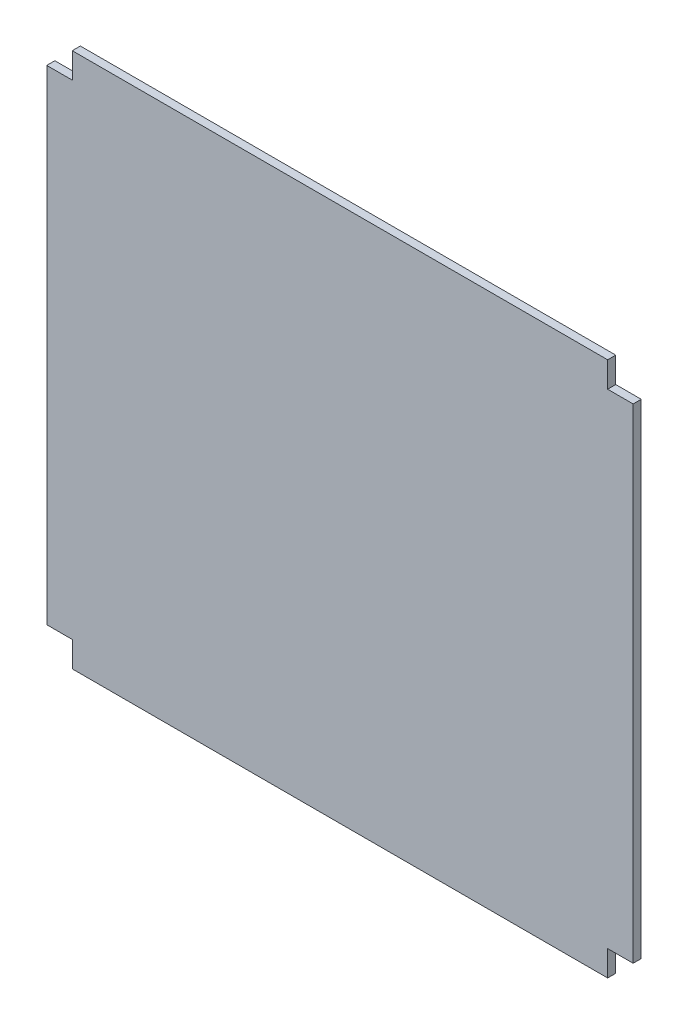
ISO-10303-21;
HEADER;
FILE_DESCRIPTION(('STEP AP214'),'2;1');
FILE_NAME('part.step','',(''),(''),'','','');
FILE_SCHEMA(('AUTOMOTIVE_DESIGN { 1 0 10303 214 1 1 1 1 }'));
ENDSEC;
DATA;
#1=APPLICATION_CONTEXT('core data for automotive mechanical design processes');
#2=APPLICATION_PROTOCOL_DEFINITION('international standard','automotive_design',2000,#1);
#3=PRODUCT_CONTEXT('',#1,'mechanical');
#4=PRODUCT('Part','Part','',(#3));
#5=PRODUCT_RELATED_PRODUCT_CATEGORY('part','',(#4));
#6=PRODUCT_DEFINITION_FORMATION('','',#4);
#7=PRODUCT_DEFINITION_CONTEXT('part definition',#1,'design');
#8=PRODUCT_DEFINITION('design','',#6,#7);
#9=PRODUCT_DEFINITION_SHAPE('','',#8);
#10=(LENGTH_UNIT() NAMED_UNIT(*) SI_UNIT(.MILLI.,.METRE.));
#11=(NAMED_UNIT(*) PLANE_ANGLE_UNIT() SI_UNIT($,.RADIAN.));
#12=(NAMED_UNIT(*) SI_UNIT($,.STERADIAN.) SOLID_ANGLE_UNIT());
#13=UNCERTAINTY_MEASURE_WITH_UNIT(LENGTH_MEASURE(1.E-05),#10,'distance_accuracy_value','');
#14=(GEOMETRIC_REPRESENTATION_CONTEXT(3) GLOBAL_UNCERTAINTY_ASSIGNED_CONTEXT((#13)) GLOBAL_UNIT_ASSIGNED_CONTEXT((#10,
#11,#12)) REPRESENTATION_CONTEXT('',''));
#15=CARTESIAN_POINT('',(0.,0.,0.));
#16=DIRECTION('',(0.,0.,1.));
#17=DIRECTION('',(1.,0.,0.));
#18=AXIS2_PLACEMENT_3D('',#15,#16,#17);
#19=CARTESIAN_POINT('',(-460.,-420.,12.7));
#20=DIRECTION('',(1.,0.,0.));
#21=DIRECTION('',(0.,0.,-1.));
#22=AXIS2_PLACEMENT_3D('',#19,#20,#21);
#23=PLANE('',#22);
#24=DIRECTION('',(0.,-1.,0.));
#25=VECTOR('',#24,1.);
#26=CARTESIAN_POINT('',(-460.,-420.,0.));
#27=LINE('',#26,#25);
#28=CARTESIAN_POINT('',(-460.,380.,0.));
#29=VERTEX_POINT('',#28);
#30=CARTESIAN_POINT('',(-460.,-380.,0.));
#31=VERTEX_POINT('',#30);
#32=EDGE_CURVE('E154',#29,#31,#27,.T.);
#33=ORIENTED_EDGE('',*,*,#32,.T.);
#34=DIRECTION('',(0.,0.,1.));
#35=VECTOR('',#34,1.);
#36=CARTESIAN_POINT('',(-460.,-380.,-56.5685424949242));
#37=LINE('',#36,#35);
#38=CARTESIAN_POINT('',(-460.,-380.,12.7));
#39=VERTEX_POINT('',#38);
#40=EDGE_CURVE('E189',#31,#39,#37,.T.);
#41=ORIENTED_EDGE('',*,*,#40,.T.);
#42=DIRECTION('',(0.,-1.,0.));
#43=VECTOR('',#42,1.);
#44=CARTESIAN_POINT('',(-460.,-420.,12.7));
#45=LINE('',#44,#43);
#46=CARTESIAN_POINT('',(-460.,380.,12.7));
#47=VERTEX_POINT('',#46);
#48=EDGE_CURVE('E150',#47,#39,#45,.T.);
#49=ORIENTED_EDGE('',*,*,#48,.F.);
#50=DIRECTION('',(0.,0.,1.));
#51=VECTOR('',#50,1.);
#52=CARTESIAN_POINT('',(-460.,380.,-56.5685424949242));
#53=LINE('',#52,#51);
#54=EDGE_CURVE('E172',#29,#47,#53,.T.);
#55=ORIENTED_EDGE('',*,*,#54,.F.);
#56=EDGE_LOOP('',(#33,#41,#49,#55));
#57=FACE_BOUND('',#56,.T.);
#58=ADVANCED_FACE('F33',(#57),#23,.F.);
#59=CARTESIAN_POINT('',(460.,-420.,12.7));
#60=DIRECTION('',(0.,1.,0.));
#61=DIRECTION('',(-1.,0.,0.));
#62=AXIS2_PLACEMENT_3D('',#59,#60,#61);
#63=PLANE('',#62);
#64=DIRECTION('',(1.,0.,0.));
#65=VECTOR('',#64,1.);
#66=CARTESIAN_POINT('',(460.,-420.,12.7));
#67=LINE('',#66,#65);
#68=CARTESIAN_POINT('',(-420.,-420.,12.7));
#69=VERTEX_POINT('',#68);
#70=CARTESIAN_POINT('',(420.,-420.,12.7));
#71=VERTEX_POINT('',#70);
#72=EDGE_CURVE('E148',#69,#71,#67,.T.);
#73=ORIENTED_EDGE('',*,*,#72,.F.);
#74=DIRECTION('',(0.,0.,1.));
#75=VECTOR('',#74,1.);
#76=CARTESIAN_POINT('',(-420.,-420.,-56.5685424949242));
#77=LINE('',#76,#75);
#78=CARTESIAN_POINT('',(-420.,-420.,0.));
#79=VERTEX_POINT('',#78);
#80=EDGE_CURVE('E185',#79,#69,#77,.T.);
#81=ORIENTED_EDGE('',*,*,#80,.F.);
#82=DIRECTION('',(1.,0.,0.));
#83=VECTOR('',#82,1.);
#84=CARTESIAN_POINT('',(460.,-420.,0.));
#85=LINE('',#84,#83);
#86=CARTESIAN_POINT('',(420.,-420.,0.));
#87=VERTEX_POINT('',#86);
#88=EDGE_CURVE('E157',#79,#87,#85,.T.);
#89=ORIENTED_EDGE('',*,*,#88,.T.);
#90=DIRECTION('',(0.,0.,1.));
#91=VECTOR('',#90,1.);
#92=CARTESIAN_POINT('',(420.,-420.,-56.5685424949242));
#93=LINE('',#92,#91);
#94=EDGE_CURVE('E213',#87,#71,#93,.T.);
#95=ORIENTED_EDGE('',*,*,#94,.T.);
#96=EDGE_LOOP('',(#73,#81,#89,#95));
#97=FACE_BOUND('',#96,.T.);
#98=ADVANCED_FACE('F250',(#97),#63,.F.);
#99=CARTESIAN_POINT('',(460.,-420.,12.7));
#100=DIRECTION('',(-1.,0.,0.));
#101=DIRECTION('',(0.,0.,1.));
#102=AXIS2_PLACEMENT_3D('',#99,#100,#101);
#103=PLANE('',#102);
#104=DIRECTION('',(0.,1.,0.));
#105=VECTOR('',#104,1.);
#106=CARTESIAN_POINT('',(460.,-420.,0.));
#107=LINE('',#106,#105);
#108=CARTESIAN_POINT('',(460.,-380.,0.));
#109=VERTEX_POINT('',#108);
#110=CARTESIAN_POINT('',(460.,380.,0.));
#111=VERTEX_POINT('',#110);
#112=EDGE_CURVE('E160',#109,#111,#107,.T.);
#113=ORIENTED_EDGE('',*,*,#112,.T.);
#114=DIRECTION('',(0.,0.,1.));
#115=VECTOR('',#114,1.);
#116=CARTESIAN_POINT('',(460.,380.,-56.5685424949242));
#117=LINE('',#116,#115);
#118=CARTESIAN_POINT('',(460.,380.,12.7));
#119=VERTEX_POINT('',#118);
#120=EDGE_CURVE('E147',#111,#119,#117,.T.);
#121=ORIENTED_EDGE('',*,*,#120,.T.);
#122=DIRECTION('',(0.,1.,0.));
#123=VECTOR('',#122,1.);
#124=CARTESIAN_POINT('',(460.,-420.,12.7));
#125=LINE('',#124,#123);
#126=CARTESIAN_POINT('',(460.,-380.,12.7));
#127=VERTEX_POINT('',#126);
#128=EDGE_CURVE('E41',#127,#119,#125,.T.);
#129=ORIENTED_EDGE('',*,*,#128,.F.);
#130=DIRECTION('',(0.,0.,1.));
#131=VECTOR('',#130,1.);
#132=CARTESIAN_POINT('',(460.,-380.,-56.5685424949242));
#133=LINE('',#132,#131);
#134=EDGE_CURVE('E123',#109,#127,#133,.T.);
#135=ORIENTED_EDGE('',*,*,#134,.F.);
#136=EDGE_LOOP('',(#113,#121,#129,#135));
#137=FACE_BOUND('',#136,.T.);
#138=ADVANCED_FACE('F146',(#137),#103,.F.);
#139=CARTESIAN_POINT('',(460.,420.,12.7));
#140=DIRECTION('',(0.,-1.,0.));
#141=DIRECTION('',(1.,0.,0.));
#142=AXIS2_PLACEMENT_3D('',#139,#140,#141);
#143=PLANE('',#142);
#144=DIRECTION('',(-1.,0.,0.));
#145=VECTOR('',#144,1.);
#146=CARTESIAN_POINT('',(460.,420.,12.7));
#147=LINE('',#146,#145);
#148=CARTESIAN_POINT('',(420.,420.,12.7));
#149=VERTEX_POINT('',#148);
#150=CARTESIAN_POINT('',(-420.,420.,12.7));
#151=VERTEX_POINT('',#150);
#152=EDGE_CURVE('E11',#149,#151,#147,.T.);
#153=ORIENTED_EDGE('',*,*,#152,.F.);
#154=DIRECTION('',(0.,0.,1.));
#155=VECTOR('',#154,1.);
#156=CARTESIAN_POINT('',(420.,420.,-56.5685424949242));
#157=LINE('',#156,#155);
#158=CARTESIAN_POINT('',(420.,420.,0.));
#159=VERTEX_POINT('',#158);
#160=EDGE_CURVE('E200',#159,#149,#157,.T.);
#161=ORIENTED_EDGE('',*,*,#160,.F.);
#162=DIRECTION('',(-1.,0.,0.));
#163=VECTOR('',#162,1.);
#164=CARTESIAN_POINT('',(460.,420.,0.));
#165=LINE('',#164,#163);
#166=CARTESIAN_POINT('',(-420.,420.,0.));
#167=VERTEX_POINT('',#166);
#168=EDGE_CURVE('E36',#159,#167,#165,.T.);
#169=ORIENTED_EDGE('',*,*,#168,.T.);
#170=DIRECTION('',(0.,0.,1.));
#171=VECTOR('',#170,1.);
#172=CARTESIAN_POINT('',(-420.,420.,-56.5685424949242));
#173=LINE('',#172,#171);
#174=EDGE_CURVE('E177',#167,#151,#173,.T.);
#175=ORIENTED_EDGE('',*,*,#174,.T.);
#176=EDGE_LOOP('',(#153,#161,#169,#175));
#177=FACE_BOUND('',#176,.T.);
#178=ADVANCED_FACE('F232',(#177),#143,.F.);
#179=CARTESIAN_POINT('',(0.,0.,12.7));
#180=DIRECTION('',(0.,0.,1.));
#181=DIRECTION('',(1.,0.,0.));
#182=AXIS2_PLACEMENT_3D('',#179,#180,#181);
#183=PLANE('',#182);
#184=DIRECTION('',(-1.,0.,0.));
#185=VECTOR('',#184,1.);
#186=CARTESIAN_POINT('',(-460.,-380.,12.7));
#187=LINE('',#186,#185);
#188=CARTESIAN_POINT('',(-420.,-380.,12.7));
#189=VERTEX_POINT('',#188);
#190=EDGE_CURVE('E187',#189,#39,#187,.T.);
#191=ORIENTED_EDGE('',*,*,#190,.F.);
#192=DIRECTION('',(0.,1.,0.));
#193=VECTOR('',#192,1.);
#194=CARTESIAN_POINT('',(-420.,-420.,12.7));
#195=LINE('',#194,#193);
#196=EDGE_CURVE('E194',#69,#189,#195,.T.);
#197=ORIENTED_EDGE('',*,*,#196,.F.);
#198=ORIENTED_EDGE('',*,*,#72,.T.);
#199=DIRECTION('',(0.,-1.,0.));
#200=VECTOR('',#199,1.);
#201=CARTESIAN_POINT('',(420.,-420.,12.7));
#202=LINE('',#201,#200);
#203=CARTESIAN_POINT('',(420.,-380.,12.7));
#204=VERTEX_POINT('',#203);
#205=EDGE_CURVE('E135',#204,#71,#202,.T.);
#206=ORIENTED_EDGE('',*,*,#205,.F.);
#207=DIRECTION('',(-1.,0.,0.));
#208=VECTOR('',#207,1.);
#209=CARTESIAN_POINT('',(460.,-380.,12.7));
#210=LINE('',#209,#208);
#211=EDGE_CURVE('E126',#127,#204,#210,.T.);
#212=ORIENTED_EDGE('',*,*,#211,.F.);
#213=ORIENTED_EDGE('',*,*,#128,.T.);
#214=DIRECTION('',(1.,0.,0.));
#215=VECTOR('',#214,1.);
#216=CARTESIAN_POINT('',(460.,380.,12.7));
#217=LINE('',#216,#215);
#218=CARTESIAN_POINT('',(420.,380.,12.7));
#219=VERTEX_POINT('',#218);
#220=EDGE_CURVE('E202',#219,#119,#217,.T.);
#221=ORIENTED_EDGE('',*,*,#220,.F.);
#222=DIRECTION('',(0.,-1.,0.));
#223=VECTOR('',#222,1.);
#224=CARTESIAN_POINT('',(420.,420.,12.7));
#225=LINE('',#224,#223);
#226=EDGE_CURVE('E198',#149,#219,#225,.T.);
#227=ORIENTED_EDGE('',*,*,#226,.F.);
#228=ORIENTED_EDGE('',*,*,#152,.T.);
#229=DIRECTION('',(0.,1.,0.));
#230=VECTOR('',#229,1.);
#231=CARTESIAN_POINT('',(-420.,420.,12.7));
#232=LINE('',#231,#230);
#233=CARTESIAN_POINT('',(-420.,380.,12.7));
#234=VERTEX_POINT('',#233);
#235=EDGE_CURVE('E175',#234,#151,#232,.T.);
#236=ORIENTED_EDGE('',*,*,#235,.F.);
#237=DIRECTION('',(1.,0.,0.));
#238=VECTOR('',#237,1.);
#239=CARTESIAN_POINT('',(-460.,380.,12.7));
#240=LINE('',#239,#238);
#241=EDGE_CURVE('E180',#47,#234,#240,.T.);
#242=ORIENTED_EDGE('',*,*,#241,.F.);
#243=ORIENTED_EDGE('',*,*,#48,.T.);
#244=EDGE_LOOP('',(#191,#197,#198,#206,#212,#213,#221,#227,#228,#236,#242,#243));
#245=FACE_BOUND('',#244,.T.);
#246=ADVANCED_FACE('F140',(#245),#183,.T.);
#247=CARTESIAN_POINT('',(0.,0.,0.));
#248=DIRECTION('',(0.,0.,1.));
#249=DIRECTION('',(1.,0.,0.));
#250=AXIS2_PLACEMENT_3D('',#247,#248,#249);
#251=PLANE('',#250);
#252=DIRECTION('',(0.,-1.,0.));
#253=VECTOR('',#252,1.);
#254=CARTESIAN_POINT('',(-420.,-420.,0.));
#255=LINE('',#254,#253);
#256=CARTESIAN_POINT('',(-420.,-380.,0.));
#257=VERTEX_POINT('',#256);
#258=EDGE_CURVE('E192',#257,#79,#255,.T.);
#259=ORIENTED_EDGE('',*,*,#258,.F.);
#260=DIRECTION('',(1.,0.,0.));
#261=VECTOR('',#260,1.);
#262=CARTESIAN_POINT('',(-460.,-380.,0.));
#263=LINE('',#262,#261);
#264=EDGE_CURVE('E196',#31,#257,#263,.T.);
#265=ORIENTED_EDGE('',*,*,#264,.F.);
#266=ORIENTED_EDGE('',*,*,#32,.F.);
#267=DIRECTION('',(-1.,0.,0.));
#268=VECTOR('',#267,1.);
#269=CARTESIAN_POINT('',(-460.,380.,0.));
#270=LINE('',#269,#268);
#271=CARTESIAN_POINT('',(-420.,380.,0.));
#272=VERTEX_POINT('',#271);
#273=EDGE_CURVE('E158',#272,#29,#270,.T.);
#274=ORIENTED_EDGE('',*,*,#273,.F.);
#275=DIRECTION('',(0.,-1.,0.));
#276=VECTOR('',#275,1.);
#277=CARTESIAN_POINT('',(-420.,420.,0.));
#278=LINE('',#277,#276);
#279=EDGE_CURVE('E171',#167,#272,#278,.T.);
#280=ORIENTED_EDGE('',*,*,#279,.F.);
#281=ORIENTED_EDGE('',*,*,#168,.F.);
#282=DIRECTION('',(0.,1.,0.));
#283=VECTOR('',#282,1.);
#284=CARTESIAN_POINT('',(420.,420.,0.));
#285=LINE('',#284,#283);
#286=CARTESIAN_POINT('',(420.,380.,0.));
#287=VERTEX_POINT('',#286);
#288=EDGE_CURVE('E205',#287,#159,#285,.T.);
#289=ORIENTED_EDGE('',*,*,#288,.F.);
#290=DIRECTION('',(-1.,0.,0.));
#291=VECTOR('',#290,1.);
#292=CARTESIAN_POINT('',(460.,380.,0.));
#293=LINE('',#292,#291);
#294=EDGE_CURVE('E143',#111,#287,#293,.T.);
#295=ORIENTED_EDGE('',*,*,#294,.F.);
#296=ORIENTED_EDGE('',*,*,#112,.F.);
#297=DIRECTION('',(1.,0.,0.));
#298=VECTOR('',#297,1.);
#299=CARTESIAN_POINT('',(460.,-380.,0.));
#300=LINE('',#299,#298);
#301=CARTESIAN_POINT('',(420.,-380.,0.));
#302=VERTEX_POINT('',#301);
#303=EDGE_CURVE('E129',#302,#109,#300,.T.);
#304=ORIENTED_EDGE('',*,*,#303,.F.);
#305=DIRECTION('',(0.,1.,0.));
#306=VECTOR('',#305,1.);
#307=CARTESIAN_POINT('',(420.,-420.,0.));
#308=LINE('',#307,#306);
#309=EDGE_CURVE('E210',#87,#302,#308,.T.);
#310=ORIENTED_EDGE('',*,*,#309,.F.);
#311=ORIENTED_EDGE('',*,*,#88,.F.);
#312=EDGE_LOOP('',(#259,#265,#266,#274,#280,#281,#289,#295,#296,#304,#310,#311));
#313=FACE_BOUND('',#312,.T.);
#314=ADVANCED_FACE('F224',(#313),#251,.F.);
#315=CARTESIAN_POINT('',(-420.,420.,-56.5685424949242));
#316=DIRECTION('',(1.,0.,0.));
#317=DIRECTION('',(0.,0.,-1.));
#318=AXIS2_PLACEMENT_3D('',#315,#316,#317);
#319=PLANE('',#318);
#320=ORIENTED_EDGE('',*,*,#279,.T.);
#321=DIRECTION('',(0.,0.,1.));
#322=VECTOR('',#321,1.);
#323=CARTESIAN_POINT('',(-420.,380.,-56.5685424949242));
#324=LINE('',#323,#322);
#325=EDGE_CURVE('E174',#272,#234,#324,.T.);
#326=ORIENTED_EDGE('',*,*,#325,.T.);
#327=ORIENTED_EDGE('',*,*,#235,.T.);
#328=ORIENTED_EDGE('',*,*,#174,.F.);
#329=EDGE_LOOP('',(#320,#326,#327,#328));
#330=FACE_BOUND('',#329,.T.);
#331=ADVANCED_FACE('F235',(#330),#319,.F.);
#332=CARTESIAN_POINT('',(-460.,380.,-56.5685424949242));
#333=DIRECTION('',(0.,-1.,0.));
#334=DIRECTION('',(0.,0.,-1.));
#335=AXIS2_PLACEMENT_3D('',#332,#333,#334);
#336=PLANE('',#335);
#337=ORIENTED_EDGE('',*,*,#273,.T.);
#338=ORIENTED_EDGE('',*,*,#54,.T.);
#339=ORIENTED_EDGE('',*,*,#241,.T.);
#340=ORIENTED_EDGE('',*,*,#325,.F.);
#341=EDGE_LOOP('',(#337,#338,#339,#340));
#342=FACE_BOUND('',#341,.T.);
#343=ADVANCED_FACE('F241',(#342),#336,.F.);
#344=CARTESIAN_POINT('',(420.,-420.,-56.5685424949242));
#345=DIRECTION('',(-1.,0.,0.));
#346=DIRECTION('',(0.,0.,1.));
#347=AXIS2_PLACEMENT_3D('',#344,#345,#346);
#348=PLANE('',#347);
#349=ORIENTED_EDGE('',*,*,#309,.T.);
#350=DIRECTION('',(0.,0.,1.));
#351=VECTOR('',#350,1.);
#352=CARTESIAN_POINT('',(420.,-380.,-56.5685424949242));
#353=LINE('',#352,#351);
#354=EDGE_CURVE('E134',#302,#204,#353,.T.);
#355=ORIENTED_EDGE('',*,*,#354,.T.);
#356=ORIENTED_EDGE('',*,*,#205,.T.);
#357=ORIENTED_EDGE('',*,*,#94,.F.);
#358=EDGE_LOOP('',(#349,#355,#356,#357));
#359=FACE_BOUND('',#358,.T.);
#360=ADVANCED_FACE('F220',(#359),#348,.F.);
#361=CARTESIAN_POINT('',(460.,-380.,-56.5685424949242));
#362=DIRECTION('',(0.,1.,0.));
#363=DIRECTION('',(0.,0.,1.));
#364=AXIS2_PLACEMENT_3D('',#361,#362,#363);
#365=PLANE('',#364);
#366=ORIENTED_EDGE('',*,*,#303,.T.);
#367=ORIENTED_EDGE('',*,*,#134,.T.);
#368=ORIENTED_EDGE('',*,*,#211,.T.);
#369=ORIENTED_EDGE('',*,*,#354,.F.);
#370=EDGE_LOOP('',(#366,#367,#368,#369));
#371=FACE_BOUND('',#370,.T.);
#372=ADVANCED_FACE('F125',(#371),#365,.F.);
#373=CARTESIAN_POINT('',(460.,380.,-56.5685424949242));
#374=DIRECTION('',(0.,-1.,0.));
#375=DIRECTION('',(1.,0.,0.));
#376=AXIS2_PLACEMENT_3D('',#373,#374,#375);
#377=PLANE('',#376);
#378=ORIENTED_EDGE('',*,*,#294,.T.);
#379=DIRECTION('',(0.,0.,1.));
#380=VECTOR('',#379,1.);
#381=CARTESIAN_POINT('',(420.,380.,-56.5685424949242));
#382=LINE('',#381,#380);
#383=EDGE_CURVE('E57',#287,#219,#382,.T.);
#384=ORIENTED_EDGE('',*,*,#383,.T.);
#385=ORIENTED_EDGE('',*,*,#220,.T.);
#386=ORIENTED_EDGE('',*,*,#120,.F.);
#387=EDGE_LOOP('',(#378,#384,#385,#386));
#388=FACE_BOUND('',#387,.T.);
#389=ADVANCED_FACE('F228',(#388),#377,.F.);
#390=CARTESIAN_POINT('',(420.,420.,-56.5685424949242));
#391=DIRECTION('',(-1.,0.,0.));
#392=DIRECTION('',(0.,0.,1.));
#393=AXIS2_PLACEMENT_3D('',#390,#391,#392);
#394=PLANE('',#393);
#395=ORIENTED_EDGE('',*,*,#288,.T.);
#396=ORIENTED_EDGE('',*,*,#160,.T.);
#397=ORIENTED_EDGE('',*,*,#226,.T.);
#398=ORIENTED_EDGE('',*,*,#383,.F.);
#399=EDGE_LOOP('',(#395,#396,#397,#398));
#400=FACE_BOUND('',#399,.T.);
#401=ADVANCED_FACE('F272',(#400),#394,.F.);
#402=CARTESIAN_POINT('',(-460.,-380.,-56.5685424949242));
#403=DIRECTION('',(0.,1.,0.));
#404=DIRECTION('',(0.,0.,1.));
#405=AXIS2_PLACEMENT_3D('',#402,#403,#404);
#406=PLANE('',#405);
#407=ORIENTED_EDGE('',*,*,#264,.T.);
#408=DIRECTION('',(0.,0.,1.));
#409=VECTOR('',#408,1.);
#410=CARTESIAN_POINT('',(-420.,-380.,-56.5685424949242));
#411=LINE('',#410,#409);
#412=EDGE_CURVE('E49',#257,#189,#411,.T.);
#413=ORIENTED_EDGE('',*,*,#412,.T.);
#414=ORIENTED_EDGE('',*,*,#190,.T.);
#415=ORIENTED_EDGE('',*,*,#40,.F.);
#416=EDGE_LOOP('',(#407,#413,#414,#415));
#417=FACE_BOUND('',#416,.T.);
#418=ADVANCED_FACE('F244',(#417),#406,.F.);
#419=CARTESIAN_POINT('',(-420.,-420.,-56.5685424949242));
#420=DIRECTION('',(1.,0.,0.));
#421=DIRECTION('',(0.,0.,-1.));
#422=AXIS2_PLACEMENT_3D('',#419,#420,#421);
#423=PLANE('',#422);
#424=ORIENTED_EDGE('',*,*,#258,.T.);
#425=ORIENTED_EDGE('',*,*,#80,.T.);
#426=ORIENTED_EDGE('',*,*,#196,.T.);
#427=ORIENTED_EDGE('',*,*,#412,.F.);
#428=EDGE_LOOP('',(#424,#425,#426,#427));
#429=FACE_BOUND('',#428,.T.);
#430=ADVANCED_FACE('F246',(#429),#423,.F.);
#431=CLOSED_SHELL('',(#58,#98,#138,#178,#246,#314,#331,#343,#360,#372,#389,#401,#418,#430));
#432=MANIFOLD_SOLID_BREP('B2',#431);
#433=ADVANCED_BREP_SHAPE_REPRESENTATION('',(#18,#432),#14);
#434=SHAPE_DEFINITION_REPRESENTATION(#9,#433);
ENDSEC;
END-ISO-10303-21;
